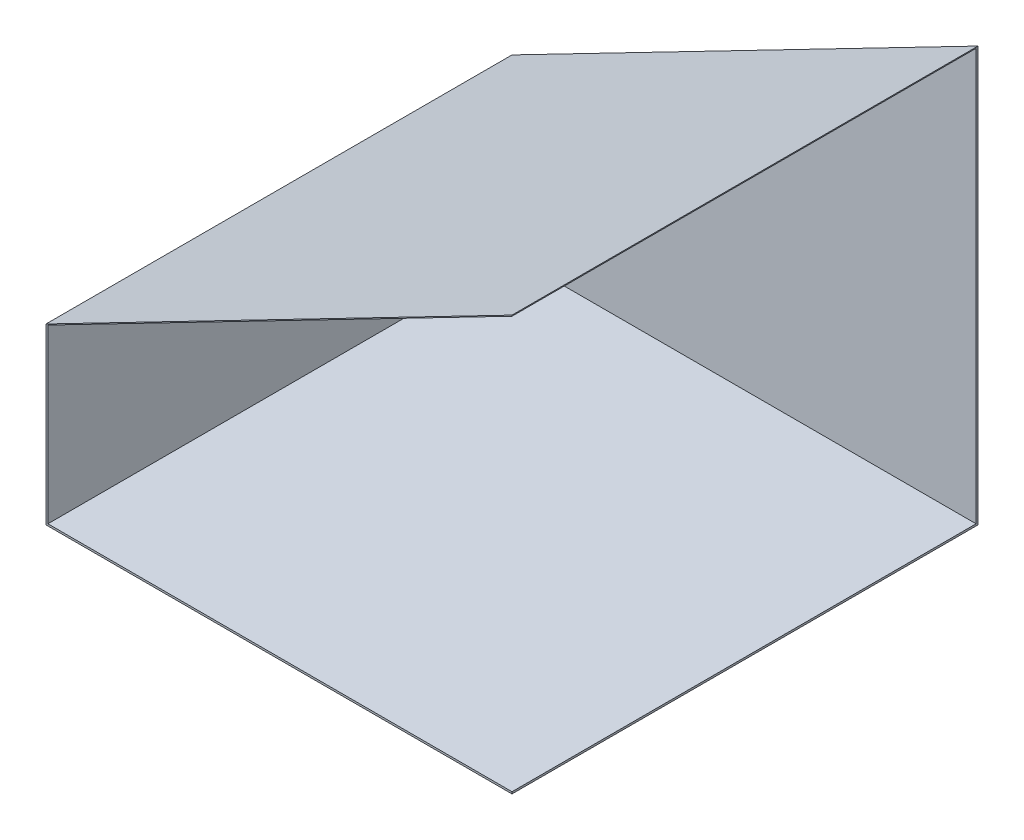
ISO-10303-21;
HEADER;
FILE_DESCRIPTION(('STEP AP214'),'2;1');
FILE_NAME('part.step','',(''),(''),'','','');
FILE_SCHEMA(('AUTOMOTIVE_DESIGN { 1 0 10303 214 1 1 1 1 }'));
ENDSEC;
DATA;
#1=APPLICATION_CONTEXT('core data for automotive mechanical design processes');
#2=APPLICATION_PROTOCOL_DEFINITION('international standard','automotive_design',2000,#1);
#3=PRODUCT_CONTEXT('',#1,'mechanical');
#4=PRODUCT('Part','Part','',(#3));
#5=PRODUCT_RELATED_PRODUCT_CATEGORY('part','',(#4));
#6=PRODUCT_DEFINITION_FORMATION('','',#4);
#7=PRODUCT_DEFINITION_CONTEXT('part definition',#1,'design');
#8=PRODUCT_DEFINITION('design','',#6,#7);
#9=PRODUCT_DEFINITION_SHAPE('','',#8);
#10=(LENGTH_UNIT() NAMED_UNIT(*) SI_UNIT(.MILLI.,.METRE.));
#11=(NAMED_UNIT(*) PLANE_ANGLE_UNIT() SI_UNIT($,.RADIAN.));
#12=(NAMED_UNIT(*) SI_UNIT($,.STERADIAN.) SOLID_ANGLE_UNIT());
#13=UNCERTAINTY_MEASURE_WITH_UNIT(LENGTH_MEASURE(1.E-05),#10,'distance_accuracy_value','');
#14=(GEOMETRIC_REPRESENTATION_CONTEXT(3) GLOBAL_UNCERTAINTY_ASSIGNED_CONTEXT((#13)) GLOBAL_UNIT_ASSIGNED_CONTEXT((#10,
#11,#12)) REPRESENTATION_CONTEXT('',''));
#15=CARTESIAN_POINT('',(0.,0.,0.));
#16=DIRECTION('',(0.,0.,1.));
#17=DIRECTION('',(1.,0.,0.));
#18=AXIS2_PLACEMENT_3D('',#15,#16,#17);
#19=CARTESIAN_POINT('',(0.,4572.,-26022.0350141595));
#20=DIRECTION('',(0.458883686879013,-0.888496348848055,0.));
#21=DIRECTION('',(0.888496348848055,0.458883686879013,0.));
#22=AXIS2_PLACEMENT_3D('',#19,#20,#21);
#23=PLANE('',#22);
#24=DIRECTION('',(0.,0.,-1.));
#25=VECTOR('',#24,1.);
#26=CARTESIAN_POINT('',(0.,4572.,-12192.));
#27=LINE('',#26,#25);
#28=CARTESIAN_POINT('',(0.,4572.,0.));
#29=VERTEX_POINT('',#28);
#30=CARTESIAN_POINT('',(4.7679880361686E-12,4572.,-12192.));
#31=VERTEX_POINT('',#30);
#32=EDGE_CURVE('E112',#29,#31,#27,.T.);
#33=ORIENTED_EDGE('',*,*,#32,.T.);
#34=DIRECTION('',(0.888496348848055,0.458883686879013,0.));
#35=VECTOR('',#34,1.);
#36=CARTESIAN_POINT('',(0.,4572.,-12192.));
#37=LINE('',#36,#35);
#38=CARTESIAN_POINT('',(12192.,10868.8293766007,-12192.));
#39=VERTEX_POINT('',#38);
#40=EDGE_CURVE('E11',#31,#39,#37,.T.);
#41=ORIENTED_EDGE('',*,*,#40,.T.);
#42=DIRECTION('',(0.,0.,1.));
#43=VECTOR('',#42,1.);
#44=CARTESIAN_POINT('',(12192.,10868.8293766007,-26022.0350141595));
#45=LINE('',#44,#43);
#46=CARTESIAN_POINT('',(12192.,10868.8293766007,0.));
#47=VERTEX_POINT('',#46);
#48=EDGE_CURVE('E178',#39,#47,#45,.T.);
#49=ORIENTED_EDGE('',*,*,#48,.T.);
#50=DIRECTION('',(0.888496348848055,0.458883686879013,0.));
#51=VECTOR('',#50,1.);
#52=CARTESIAN_POINT('',(0.,4572.,0.));
#53=LINE('',#52,#51);
#54=EDGE_CURVE('E121',#29,#47,#53,.T.);
#55=ORIENTED_EDGE('',*,*,#54,.F.);
#56=EDGE_LOOP('',(#33,#41,#49,#55));
#57=FACE_BOUND('',#56,.T.);
#58=ADVANCED_FACE('F39',(#57),#23,.T.);
#59=CARTESIAN_POINT('',(0.,50.8,0.));
#60=DIRECTION('',(0.,0.,-1.));
#61=DIRECTION('',(-1.,0.,0.));
#62=AXIS2_PLACEMENT_3D('',#59,#60,#61);
#63=PLANE('',#62);
#64=DIRECTION('',(1.,0.,0.));
#65=VECTOR('',#64,1.);
#66=CARTESIAN_POINT('',(0.,0.,0.));
#67=LINE('',#66,#65);
#68=CARTESIAN_POINT('',(-50.8,0.,0.));
#69=VERTEX_POINT('',#68);
#70=CARTESIAN_POINT('',(12192.,0.,0.));
#71=VERTEX_POINT('',#70);
#72=EDGE_CURVE('E143',#69,#71,#67,.T.);
#73=ORIENTED_EDGE('',*,*,#72,.T.);
#74=DIRECTION('',(0.,-1.,0.));
#75=VECTOR('',#74,1.);
#76=CARTESIAN_POINT('',(12192.,50.8,0.));
#77=LINE('',#76,#75);
#78=CARTESIAN_POINT('',(12192.,50.8,0.));
#79=VERTEX_POINT('',#78);
#80=EDGE_CURVE('E49',#79,#71,#77,.T.);
#81=ORIENTED_EDGE('',*,*,#80,.F.);
#82=DIRECTION('',(1.,0.,0.));
#83=VECTOR('',#82,1.);
#84=CARTESIAN_POINT('',(0.,50.8,0.));
#85=LINE('',#84,#83);
#86=CARTESIAN_POINT('',(0.,50.8,0.));
#87=VERTEX_POINT('',#86);
#88=EDGE_CURVE('E56',#87,#79,#85,.T.);
#89=ORIENTED_EDGE('',*,*,#88,.F.);
#90=DIRECTION('',(0.,1.,0.));
#91=VECTOR('',#90,1.);
#92=CARTESIAN_POINT('',(0.,0.,0.));
#93=LINE('',#92,#91);
#94=EDGE_CURVE('E117',#87,#29,#93,.T.);
#95=ORIENTED_EDGE('',*,*,#94,.T.);
#96=ORIENTED_EDGE('',*,*,#54,.T.);
#97=DIRECTION('',(0.,1.,0.));
#98=VECTOR('',#97,1.);
#99=CARTESIAN_POINT('',(12192.,10868.8293766007,0.));
#100=LINE('',#99,#98);
#101=CARTESIAN_POINT('',(12192.,10895.0661656699,0.));
#102=VERTEX_POINT('',#101);
#103=EDGE_CURVE('E204',#47,#102,#100,.T.);
#104=ORIENTED_EDGE('',*,*,#103,.T.);
#105=DIRECTION('',(-0.888496348848055,-0.458883686879013,0.));
#106=VECTOR('',#105,1.);
#107=CARTESIAN_POINT('',(-50.8,4572.,0.));
#108=LINE('',#107,#106);
#109=CARTESIAN_POINT('',(-50.8,4572.,0.));
#110=VERTEX_POINT('',#109);
#111=EDGE_CURVE('E199',#102,#110,#108,.T.);
#112=ORIENTED_EDGE('',*,*,#111,.T.);
#113=DIRECTION('',(0.,1.,0.));
#114=VECTOR('',#113,1.);
#115=CARTESIAN_POINT('',(-50.8,0.,0.));
#116=LINE('',#115,#114);
#117=EDGE_CURVE('E128',#69,#110,#116,.T.);
#118=ORIENTED_EDGE('',*,*,#117,.F.);
#119=EDGE_LOOP('',(#73,#81,#89,#95,#96,#104,#112,#118));
#120=FACE_BOUND('',#119,.T.);
#121=ADVANCED_FACE('F41',(#120),#63,.F.);
#122=CARTESIAN_POINT('',(12192.,50.8,0.));
#123=DIRECTION('',(-1.,0.,0.));
#124=DIRECTION('',(0.,0.,1.));
#125=AXIS2_PLACEMENT_3D('',#122,#123,#124);
#126=PLANE('',#125);
#127=DIRECTION('',(0.,0.,-1.));
#128=VECTOR('',#127,1.);
#129=CARTESIAN_POINT('',(12192.,0.,0.));
#130=LINE('',#129,#128);
#131=CARTESIAN_POINT('',(12192.,0.,-12242.8));
#132=VERTEX_POINT('',#131);
#133=EDGE_CURVE('E134',#71,#132,#130,.T.);
#134=ORIENTED_EDGE('',*,*,#133,.T.);
#135=DIRECTION('',(0.,-1.,0.));
#136=VECTOR('',#135,1.);
#137=CARTESIAN_POINT('',(12192.,0.,-12242.8));
#138=LINE('',#137,#136);
#139=CARTESIAN_POINT('',(12192.,10895.0661656699,-12242.8));
#140=VERTEX_POINT('',#139);
#141=EDGE_CURVE('E166',#140,#132,#138,.T.);
#142=ORIENTED_EDGE('',*,*,#141,.F.);
#143=DIRECTION('',(0.,0.,1.));
#144=VECTOR('',#143,1.);
#145=CARTESIAN_POINT('',(12192.,10895.0661656699,-26022.0350141595));
#146=LINE('',#145,#144);
#147=EDGE_CURVE('E194',#140,#102,#146,.T.);
#148=ORIENTED_EDGE('',*,*,#147,.T.);
#149=ORIENTED_EDGE('',*,*,#103,.F.);
#150=ORIENTED_EDGE('',*,*,#48,.F.);
#151=DIRECTION('',(0.,-1.,0.));
#152=VECTOR('',#151,1.);
#153=CARTESIAN_POINT('',(12192.,0.,-12192.));
#154=LINE('',#153,#152);
#155=CARTESIAN_POINT('',(12192.,50.8,-12192.));
#156=VERTEX_POINT('',#155);
#157=EDGE_CURVE('E105',#39,#156,#154,.T.);
#158=ORIENTED_EDGE('',*,*,#157,.T.);
#159=DIRECTION('',(0.,0.,-1.));
#160=VECTOR('',#159,1.);
#161=CARTESIAN_POINT('',(12192.,50.8,0.));
#162=LINE('',#161,#160);
#163=EDGE_CURVE('E137',#79,#156,#162,.T.);
#164=ORIENTED_EDGE('',*,*,#163,.F.);
#165=ORIENTED_EDGE('',*,*,#80,.T.);
#166=EDGE_LOOP('',(#134,#142,#148,#149,#150,#158,#164,#165));
#167=FACE_BOUND('',#166,.T.);
#168=ADVANCED_FACE('F154',(#167),#126,.F.);
#169=CARTESIAN_POINT('',(0.,50.8,0.));
#170=DIRECTION('',(0.,-1.,0.));
#171=DIRECTION('',(0.,0.,-1.));
#172=AXIS2_PLACEMENT_3D('',#169,#170,#171);
#173=PLANE('',#172);
#174=DIRECTION('',(0.,0.,1.));
#175=VECTOR('',#174,1.);
#176=CARTESIAN_POINT('',(0.,50.8,0.));
#177=LINE('',#176,#175);
#178=CARTESIAN_POINT('',(0.,50.8,-12192.));
#179=VERTEX_POINT('',#178);
#180=EDGE_CURVE('E114',#179,#87,#177,.T.);
#181=ORIENTED_EDGE('',*,*,#180,.T.);
#182=ORIENTED_EDGE('',*,*,#88,.T.);
#183=ORIENTED_EDGE('',*,*,#163,.T.);
#184=DIRECTION('',(-1.,0.,0.));
#185=VECTOR('',#184,1.);
#186=CARTESIAN_POINT('',(0.,50.8,-12192.));
#187=LINE('',#186,#185);
#188=EDGE_CURVE('E140',#156,#179,#187,.T.);
#189=ORIENTED_EDGE('',*,*,#188,.T.);
#190=EDGE_LOOP('',(#181,#182,#183,#189));
#191=FACE_BOUND('',#190,.T.);
#192=ADVANCED_FACE('F209',(#191),#173,.F.);
#193=CARTESIAN_POINT('',(0.,0.,0.));
#194=DIRECTION('',(0.,-1.,0.));
#195=DIRECTION('',(0.,0.,-1.));
#196=AXIS2_PLACEMENT_3D('',#193,#194,#195);
#197=PLANE('',#196);
#198=ORIENTED_EDGE('',*,*,#72,.F.);
#199=DIRECTION('',(0.,0.,1.));
#200=VECTOR('',#199,1.);
#201=CARTESIAN_POINT('',(-50.8,0.,-12192.));
#202=LINE('',#201,#200);
#203=CARTESIAN_POINT('',(-50.8,0.,-12242.8));
#204=VERTEX_POINT('',#203);
#205=EDGE_CURVE('E123',#204,#69,#202,.T.);
#206=ORIENTED_EDGE('',*,*,#205,.F.);
#207=DIRECTION('',(-1.,0.,0.));
#208=VECTOR('',#207,1.);
#209=CARTESIAN_POINT('',(12192.,0.,-12242.8));
#210=LINE('',#209,#208);
#211=EDGE_CURVE('E160',#132,#204,#210,.T.);
#212=ORIENTED_EDGE('',*,*,#211,.F.);
#213=ORIENTED_EDGE('',*,*,#133,.F.);
#214=EDGE_LOOP('',(#198,#206,#212,#213));
#215=FACE_BOUND('',#214,.T.);
#216=ADVANCED_FACE('F158',(#215),#197,.T.);
#217=CARTESIAN_POINT('',(0.,0.,0.));
#218=DIRECTION('',(1.,0.,0.));
#219=DIRECTION('',(0.,0.,-1.));
#220=AXIS2_PLACEMENT_3D('',#217,#218,#219);
#221=PLANE('',#220);
#222=ORIENTED_EDGE('',*,*,#180,.F.);
#223=DIRECTION('',(0.,-1.,0.));
#224=VECTOR('',#223,1.);
#225=CARTESIAN_POINT('',(0.,0.,-12192.));
#226=LINE('',#225,#224);
#227=EDGE_CURVE('E102',#31,#179,#226,.T.);
#228=ORIENTED_EDGE('',*,*,#227,.F.);
#229=ORIENTED_EDGE('',*,*,#32,.F.);
#230=ORIENTED_EDGE('',*,*,#94,.F.);
#231=EDGE_LOOP('',(#222,#228,#229,#230));
#232=FACE_BOUND('',#231,.T.);
#233=ADVANCED_FACE('F111',(#232),#221,.T.);
#234=CARTESIAN_POINT('',(-50.8,0.,0.));
#235=DIRECTION('',(1.,0.,0.));
#236=DIRECTION('',(0.,0.,-1.));
#237=AXIS2_PLACEMENT_3D('',#234,#235,#236);
#238=PLANE('',#237);
#239=DIRECTION('',(0.,0.,-1.));
#240=VECTOR('',#239,1.);
#241=CARTESIAN_POINT('',(-50.8,4572.,-12192.));
#242=LINE('',#241,#240);
#243=CARTESIAN_POINT('',(-50.8,4572.,-12242.8));
#244=VERTEX_POINT('',#243);
#245=EDGE_CURVE('E147',#110,#244,#242,.T.);
#246=ORIENTED_EDGE('',*,*,#245,.T.);
#247=DIRECTION('',(0.,1.,0.));
#248=VECTOR('',#247,1.);
#249=CARTESIAN_POINT('',(-50.8,0.,-12242.8));
#250=LINE('',#249,#248);
#251=EDGE_CURVE('E118',#204,#244,#250,.T.);
#252=ORIENTED_EDGE('',*,*,#251,.F.);
#253=ORIENTED_EDGE('',*,*,#205,.T.);
#254=ORIENTED_EDGE('',*,*,#117,.T.);
#255=EDGE_LOOP('',(#246,#252,#253,#254));
#256=FACE_BOUND('',#255,.T.);
#257=ADVANCED_FACE('F188',(#256),#238,.F.);
#258=CARTESIAN_POINT('',(0.,0.,-12242.8));
#259=DIRECTION('',(0.,0.,1.));
#260=DIRECTION('',(1.,0.,0.));
#261=AXIS2_PLACEMENT_3D('',#258,#259,#260);
#262=PLANE('',#261);
#263=ORIENTED_EDGE('',*,*,#251,.T.);
#264=DIRECTION('',(0.888496348848055,0.458883686879013,0.));
#265=VECTOR('',#264,1.);
#266=CARTESIAN_POINT('',(-50.8,4572.,-12242.8));
#267=LINE('',#266,#265);
#268=EDGE_CURVE('E171',#244,#140,#267,.T.);
#269=ORIENTED_EDGE('',*,*,#268,.T.);
#270=ORIENTED_EDGE('',*,*,#141,.T.);
#271=ORIENTED_EDGE('',*,*,#211,.T.);
#272=EDGE_LOOP('',(#263,#269,#270,#271));
#273=FACE_BOUND('',#272,.T.);
#274=ADVANCED_FACE('F169',(#273),#262,.F.);
#275=CARTESIAN_POINT('',(0.,0.,-12192.));
#276=DIRECTION('',(0.,0.,1.));
#277=DIRECTION('',(1.,0.,0.));
#278=AXIS2_PLACEMENT_3D('',#275,#276,#277);
#279=PLANE('',#278);
#280=ORIENTED_EDGE('',*,*,#157,.F.);
#281=ORIENTED_EDGE('',*,*,#40,.F.);
#282=ORIENTED_EDGE('',*,*,#227,.T.);
#283=ORIENTED_EDGE('',*,*,#188,.F.);
#284=EDGE_LOOP('',(#280,#281,#282,#283));
#285=FACE_BOUND('',#284,.T.);
#286=ADVANCED_FACE('F101',(#285),#279,.T.);
#287=CARTESIAN_POINT('',(-50.8,4572.,-26022.0350141595));
#288=DIRECTION('',(-0.458883686879013,0.888496348848055,0.));
#289=DIRECTION('',(-0.888496348848055,-0.458883686879013,0.));
#290=AXIS2_PLACEMENT_3D('',#287,#288,#289);
#291=PLANE('',#290);
#292=ORIENTED_EDGE('',*,*,#268,.F.);
#293=ORIENTED_EDGE('',*,*,#245,.F.);
#294=ORIENTED_EDGE('',*,*,#111,.F.);
#295=ORIENTED_EDGE('',*,*,#147,.F.);
#296=EDGE_LOOP('',(#292,#293,#294,#295));
#297=FACE_BOUND('',#296,.T.);
#298=ADVANCED_FACE('F193',(#297),#291,.T.);
#299=CLOSED_SHELL('',(#58,#121,#168,#192,#216,#233,#257,#274,#286,#298));
#300=MANIFOLD_SOLID_BREP('B2',#299);
#301=ADVANCED_BREP_SHAPE_REPRESENTATION('',(#18,#300),#14);
#302=SHAPE_DEFINITION_REPRESENTATION(#9,#301);
ENDSEC;
END-ISO-10303-21;
